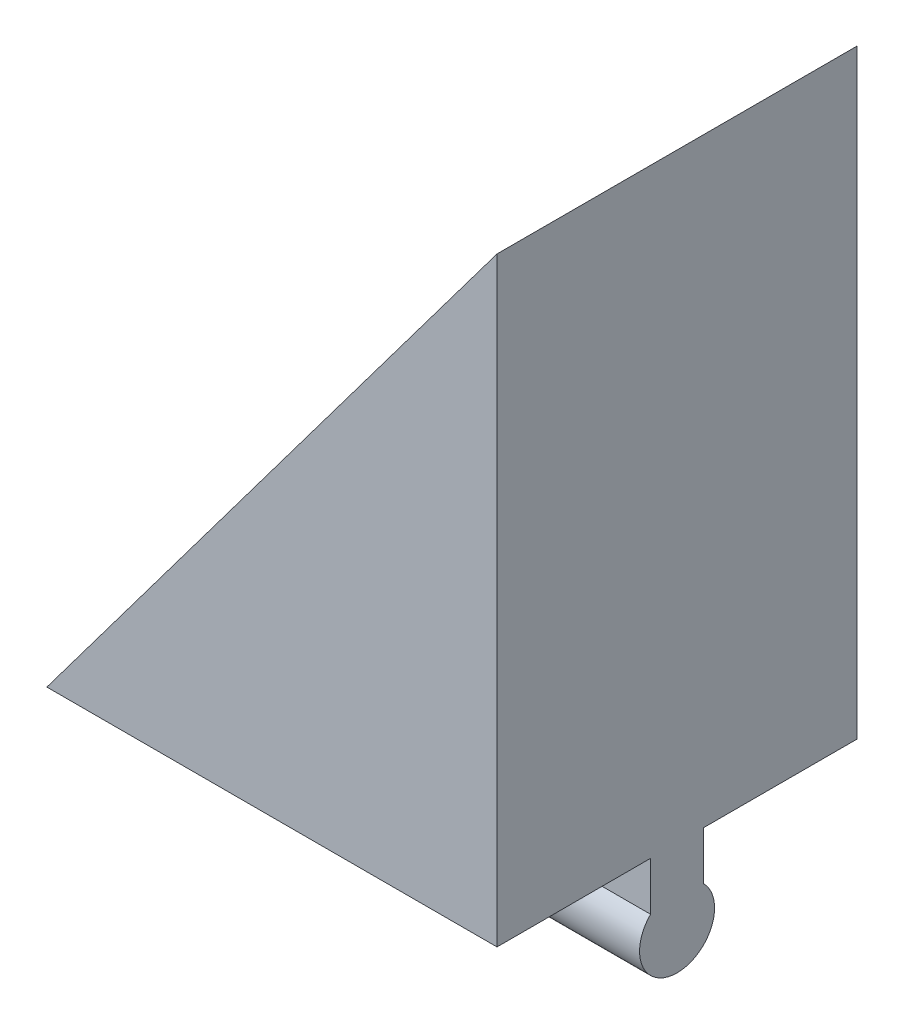
ISO-10303-21;
HEADER;
FILE_DESCRIPTION(('STEP AP214'),'2;1');
FILE_NAME('part.step','',(''),(''),'','','');
FILE_SCHEMA(('AUTOMOTIVE_DESIGN { 1 0 10303 214 1 1 1 1 }'));
ENDSEC;
DATA;
#1=APPLICATION_CONTEXT('core data for automotive mechanical design processes');
#2=APPLICATION_PROTOCOL_DEFINITION('international standard','automotive_design',2000,#1);
#3=PRODUCT_CONTEXT('',#1,'mechanical');
#4=PRODUCT('Part','Part','',(#3));
#5=PRODUCT_RELATED_PRODUCT_CATEGORY('part','',(#4));
#6=PRODUCT_DEFINITION_FORMATION('','',#4);
#7=PRODUCT_DEFINITION_CONTEXT('part definition',#1,'design');
#8=PRODUCT_DEFINITION('design','',#6,#7);
#9=PRODUCT_DEFINITION_SHAPE('','',#8);
#10=(LENGTH_UNIT() NAMED_UNIT(*) SI_UNIT(.MILLI.,.METRE.));
#11=(NAMED_UNIT(*) PLANE_ANGLE_UNIT() SI_UNIT($,.RADIAN.));
#12=(NAMED_UNIT(*) SI_UNIT($,.STERADIAN.) SOLID_ANGLE_UNIT());
#13=UNCERTAINTY_MEASURE_WITH_UNIT(LENGTH_MEASURE(1.E-05),#10,'distance_accuracy_value','');
#14=(GEOMETRIC_REPRESENTATION_CONTEXT(3) GLOBAL_UNCERTAINTY_ASSIGNED_CONTEXT((#13)) GLOBAL_UNIT_ASSIGNED_CONTEXT((#10,
#11,#12)) REPRESENTATION_CONTEXT('',''));
#15=CARTESIAN_POINT('',(0.,0.,0.));
#16=DIRECTION('',(0.,0.,1.));
#17=DIRECTION('',(1.,0.,0.));
#18=AXIS2_PLACEMENT_3D('',#15,#16,#17);
#19=CARTESIAN_POINT('',(15.,-17.,4.));
#20=DIRECTION('',(0.,-1.,0.));
#21=DIRECTION('',(0.,0.,-1.));
#22=AXIS2_PLACEMENT_3D('',#19,#20,#21);
#23=PLANE('',#22);
#24=DIRECTION('',(0.,0.,-1.));
#25=VECTOR('',#24,1.);
#26=CARTESIAN_POINT('',(-15.,-17.,24.));
#27=LINE('',#26,#25);
#28=CARTESIAN_POINT('',(-15.,-17.,24.));
#29=VERTEX_POINT('',#28);
#30=CARTESIAN_POINT('',(-15.,-17.,13.7677669529664));
#31=VERTEX_POINT('',#30);
#32=EDGE_CURVE('E48',#29,#31,#27,.T.);
#33=ORIENTED_EDGE('',*,*,#32,.T.);
#34=DIRECTION('',(1.,0.,0.));
#35=VECTOR('',#34,1.);
#36=CARTESIAN_POINT('',(-15.,-17.,13.7677669529664));
#37=LINE('',#36,#35);
#38=CARTESIAN_POINT('',(15.,-17.,13.7677669529664));
#39=VERTEX_POINT('',#38);
#40=EDGE_CURVE('E118',#31,#39,#37,.T.);
#41=ORIENTED_EDGE('',*,*,#40,.T.);
#42=DIRECTION('',(0.,0.,1.));
#43=VECTOR('',#42,1.);
#44=CARTESIAN_POINT('',(15.,-17.,4.));
#45=LINE('',#44,#43);
#46=CARTESIAN_POINT('',(15.,-17.,24.));
#47=VERTEX_POINT('',#46);
#48=EDGE_CURVE('E136',#39,#47,#45,.T.);
#49=ORIENTED_EDGE('',*,*,#48,.T.);
#50=DIRECTION('',(1.,0.,0.));
#51=VECTOR('',#50,1.);
#52=CARTESIAN_POINT('',(-15.,-17.,24.));
#53=LINE('',#52,#51);
#54=EDGE_CURVE('E129',#29,#47,#53,.T.);
#55=ORIENTED_EDGE('',*,*,#54,.F.);
#56=EDGE_LOOP('',(#33,#41,#49,#55));
#57=FACE_BOUND('',#56,.T.);
#58=ADVANCED_FACE('F40',(#57),#23,.T.);
#59=DIRECTION('',(1.,0.,0.));
#60=VECTOR('',#59,1.);
#61=CARTESIAN_POINT('',(-15.,-17.,10.2322330470336));
#62=LINE('',#61,#60);
#63=CARTESIAN_POINT('',(-15.,-17.,10.2322330470336));
#64=VERTEX_POINT('',#63);
#65=CARTESIAN_POINT('',(15.,-17.,10.2322330470336));
#66=VERTEX_POINT('',#65);
#67=EDGE_CURVE('E130',#64,#66,#62,.T.);
#68=ORIENTED_EDGE('',*,*,#67,.F.);
#69=CARTESIAN_POINT('',(-15.,-17.,0.));
#70=VERTEX_POINT('',#69);
#71=EDGE_CURVE('E149',#64,#70,#27,.T.);
#72=ORIENTED_EDGE('',*,*,#71,.T.);
#73=DIRECTION('',(1.,0.,0.));
#74=VECTOR('',#73,1.);
#75=CARTESIAN_POINT('',(-15.,-17.,0.));
#76=LINE('',#75,#74);
#77=CARTESIAN_POINT('',(15.,-17.,0.));
#78=VERTEX_POINT('',#77);
#79=EDGE_CURVE('E133',#70,#78,#76,.T.);
#80=ORIENTED_EDGE('',*,*,#79,.T.);
#81=EDGE_CURVE('E139',#78,#66,#45,.T.);
#82=ORIENTED_EDGE('',*,*,#81,.T.);
#83=EDGE_LOOP('',(#68,#72,#80,#82));
#84=FACE_BOUND('',#83,.T.);
#85=ADVANCED_FACE('F160',(#84),#23,.T.);
#86=CARTESIAN_POINT('',(15.,0.,24.));
#87=DIRECTION('',(1.,0.,0.));
#88=DIRECTION('',(0.,0.,-1.));
#89=AXIS2_PLACEMENT_3D('',#86,#87,#88);
#90=PLANE('',#89);
#91=DIRECTION('',(0.,-1.,0.));
#92=VECTOR('',#91,1.);
#93=CARTESIAN_POINT('',(15.,0.,24.));
#94=LINE('',#93,#92);
#95=CARTESIAN_POINT('',(15.,23.,24.));
#96=VERTEX_POINT('',#95);
#97=EDGE_CURVE('E143',#96,#47,#94,.T.);
#98=ORIENTED_EDGE('',*,*,#97,.T.);
#99=ORIENTED_EDGE('',*,*,#48,.F.);
#100=DIRECTION('',(0.,-1.,0.));
#101=VECTOR('',#100,1.);
#102=CARTESIAN_POINT('',(15.,0.,13.7677669529664));
#103=LINE('',#102,#101);
#104=CARTESIAN_POINT('',(15.,-20.23,13.7677669529664));
#105=VERTEX_POINT('',#104);
#106=EDGE_CURVE('E55',#39,#105,#103,.T.);
#107=ORIENTED_EDGE('',*,*,#106,.T.);
#108=CARTESIAN_POINT('',(15.,-21.9977669529664,12.));
#109=DIRECTION('',(1.,0.,0.));
#110=DIRECTION('',(0.,0.,-1.));
#111=AXIS2_PLACEMENT_3D('',#108,#109,#110);
#112=CIRCLE('',#111,2.5);
#113=CARTESIAN_POINT('',(15.,-20.23,10.2322330470336));
#114=VERTEX_POINT('',#113);
#115=EDGE_CURVE('E103',#105,#114,#112,.T.);
#116=ORIENTED_EDGE('',*,*,#115,.T.);
#117=DIRECTION('',(0.,-1.,0.));
#118=VECTOR('',#117,1.);
#119=CARTESIAN_POINT('',(15.,0.,10.2322330470336));
#120=LINE('',#119,#118);
#121=EDGE_CURVE('E119',#66,#114,#120,.T.);
#122=ORIENTED_EDGE('',*,*,#121,.F.);
#123=ORIENTED_EDGE('',*,*,#81,.F.);
#124=DIRECTION('',(0.,-1.,0.));
#125=VECTOR('',#124,1.);
#126=CARTESIAN_POINT('',(15.,0.,0.));
#127=LINE('',#126,#125);
#128=CARTESIAN_POINT('',(15.,23.,0.));
#129=VERTEX_POINT('',#128);
#130=EDGE_CURVE('E142',#129,#78,#127,.T.);
#131=ORIENTED_EDGE('',*,*,#130,.F.);
#132=DIRECTION('',(0.,0.,-1.));
#133=VECTOR('',#132,1.);
#134=CARTESIAN_POINT('',(15.,23.,24.));
#135=LINE('',#134,#133);
#136=EDGE_CURVE('E11',#96,#129,#135,.T.);
#137=ORIENTED_EDGE('',*,*,#136,.F.);
#138=EDGE_LOOP('',(#98,#99,#107,#116,#122,#123,#131,#137));
#139=FACE_BOUND('',#138,.T.);
#140=ADVANCED_FACE('F42',(#139),#90,.T.);
#141=CARTESIAN_POINT('',(-1.44,1.08,24.));
#142=DIRECTION('',(0.8,-0.6,0.));
#143=DIRECTION('',(0.6,0.8,0.));
#144=AXIS2_PLACEMENT_3D('',#141,#142,#143);
#145=PLANE('',#144);
#146=DIRECTION('',(-0.6,-0.8,0.));
#147=VECTOR('',#146,1.);
#148=CARTESIAN_POINT('',(-1.44,1.08,0.));
#149=LINE('',#148,#147);
#150=EDGE_CURVE('E146',#129,#70,#149,.T.);
#151=ORIENTED_EDGE('',*,*,#150,.T.);
#152=ORIENTED_EDGE('',*,*,#71,.F.);
#153=DIRECTION('',(0.,0.,-1.));
#154=VECTOR('',#153,1.);
#155=CARTESIAN_POINT('',(-15.,-17.,0.));
#156=LINE('',#155,#154);
#157=EDGE_CURVE('E106',#31,#64,#156,.T.);
#158=ORIENTED_EDGE('',*,*,#157,.F.);
#159=ORIENTED_EDGE('',*,*,#32,.F.);
#160=DIRECTION('',(-0.6,-0.8,0.));
#161=VECTOR('',#160,1.);
#162=CARTESIAN_POINT('',(-1.44,1.08,24.));
#163=LINE('',#162,#161);
#164=EDGE_CURVE('E145',#96,#29,#163,.T.);
#165=ORIENTED_EDGE('',*,*,#164,.F.);
#166=ORIENTED_EDGE('',*,*,#136,.T.);
#167=EDGE_LOOP('',(#151,#152,#158,#159,#165,#166));
#168=FACE_BOUND('',#167,.T.);
#169=ADVANCED_FACE('F165',(#168),#145,.F.);
#170=CARTESIAN_POINT('',(0.,0.,24.));
#171=DIRECTION('',(0.,0.,1.));
#172=DIRECTION('',(1.,0.,0.));
#173=AXIS2_PLACEMENT_3D('',#170,#171,#172);
#174=PLANE('',#173);
#175=ORIENTED_EDGE('',*,*,#54,.T.);
#176=ORIENTED_EDGE('',*,*,#97,.F.);
#177=ORIENTED_EDGE('',*,*,#164,.T.);
#178=EDGE_LOOP('',(#175,#176,#177));
#179=FACE_BOUND('',#178,.T.);
#180=ADVANCED_FACE('F168',(#179),#174,.T.);
#181=CARTESIAN_POINT('',(0.,0.,0.));
#182=DIRECTION('',(0.,0.,1.));
#183=DIRECTION('',(1.,0.,0.));
#184=AXIS2_PLACEMENT_3D('',#181,#182,#183);
#185=PLANE('',#184);
#186=ORIENTED_EDGE('',*,*,#130,.T.);
#187=ORIENTED_EDGE('',*,*,#79,.F.);
#188=ORIENTED_EDGE('',*,*,#150,.F.);
#189=EDGE_LOOP('',(#186,#187,#188));
#190=FACE_BOUND('',#189,.T.);
#191=ADVANCED_FACE('F164',(#190),#185,.F.);
#192=CARTESIAN_POINT('',(-15.,0.,13.7677669529664));
#193=DIRECTION('',(0.,0.,1.));
#194=DIRECTION('',(1.,0.,0.));
#195=AXIS2_PLACEMENT_3D('',#192,#193,#194);
#196=PLANE('',#195);
#197=ORIENTED_EDGE('',*,*,#106,.F.);
#198=ORIENTED_EDGE('',*,*,#40,.F.);
#199=DIRECTION('',(0.,-1.,0.));
#200=VECTOR('',#199,1.);
#201=CARTESIAN_POINT('',(-15.,0.,13.7677669529664));
#202=LINE('',#201,#200);
#203=CARTESIAN_POINT('',(-15.,-20.23,13.7677669529664));
#204=VERTEX_POINT('',#203);
#205=EDGE_CURVE('E111',#31,#204,#202,.T.);
#206=ORIENTED_EDGE('',*,*,#205,.T.);
#207=DIRECTION('',(1.,0.,0.));
#208=VECTOR('',#207,1.);
#209=CARTESIAN_POINT('',(-15.,-20.23,13.7677669529664));
#210=LINE('',#209,#208);
#211=EDGE_CURVE('E98',#204,#105,#210,.T.);
#212=ORIENTED_EDGE('',*,*,#211,.T.);
#213=EDGE_LOOP('',(#197,#198,#206,#212));
#214=FACE_BOUND('',#213,.T.);
#215=ADVANCED_FACE('F117',(#214),#196,.T.);
#216=CARTESIAN_POINT('',(-15.,0.,10.2322330470336));
#217=DIRECTION('',(0.,0.,1.));
#218=DIRECTION('',(1.,0.,0.));
#219=AXIS2_PLACEMENT_3D('',#216,#217,#218);
#220=PLANE('',#219);
#221=ORIENTED_EDGE('',*,*,#121,.T.);
#222=DIRECTION('',(1.,0.,0.));
#223=VECTOR('',#222,1.);
#224=CARTESIAN_POINT('',(-15.,-20.23,10.2322330470336));
#225=LINE('',#224,#223);
#226=CARTESIAN_POINT('',(-15.,-20.23,10.2322330470336));
#227=VERTEX_POINT('',#226);
#228=EDGE_CURVE('E105',#227,#114,#225,.T.);
#229=ORIENTED_EDGE('',*,*,#228,.F.);
#230=DIRECTION('',(0.,-1.,0.));
#231=VECTOR('',#230,1.);
#232=CARTESIAN_POINT('',(-15.,0.,10.2322330470336));
#233=LINE('',#232,#231);
#234=EDGE_CURVE('E114',#64,#227,#233,.T.);
#235=ORIENTED_EDGE('',*,*,#234,.F.);
#236=ORIENTED_EDGE('',*,*,#67,.T.);
#237=EDGE_LOOP('',(#221,#229,#235,#236));
#238=FACE_BOUND('',#237,.T.);
#239=ADVANCED_FACE('F270',(#238),#220,.F.);
#240=CARTESIAN_POINT('',(-15.,-21.9977669529664,12.));
#241=DIRECTION('',(1.,0.,0.));
#242=DIRECTION('',(0.,0.,-1.));
#243=AXIS2_PLACEMENT_3D('',#240,#241,#242);
#244=CYLINDRICAL_SURFACE('',#243,2.5);
#245=ORIENTED_EDGE('',*,*,#115,.F.);
#246=ORIENTED_EDGE('',*,*,#211,.F.);
#247=CARTESIAN_POINT('',(-15.,-21.9977669529664,12.));
#248=DIRECTION('',(1.,0.,0.));
#249=DIRECTION('',(0.,0.,-1.));
#250=AXIS2_PLACEMENT_3D('',#247,#248,#249);
#251=CIRCLE('',#250,2.5);
#252=EDGE_CURVE('E101',#204,#227,#251,.T.);
#253=ORIENTED_EDGE('',*,*,#252,.T.);
#254=ORIENTED_EDGE('',*,*,#228,.T.);
#255=EDGE_LOOP('',(#245,#246,#253,#254));
#256=FACE_BOUND('',#255,.T.);
#257=ADVANCED_FACE('F100',(#256),#244,.T.);
#258=CARTESIAN_POINT('',(-15.,0.,0.));
#259=DIRECTION('',(1.,0.,0.));
#260=DIRECTION('',(0.,0.,-1.));
#261=AXIS2_PLACEMENT_3D('',#258,#259,#260);
#262=PLANE('',#261);
#263=ORIENTED_EDGE('',*,*,#205,.F.);
#264=ORIENTED_EDGE('',*,*,#157,.T.);
#265=ORIENTED_EDGE('',*,*,#234,.T.);
#266=ORIENTED_EDGE('',*,*,#252,.F.);
#267=EDGE_LOOP('',(#263,#264,#265,#266));
#268=FACE_BOUND('',#267,.T.);
#269=ADVANCED_FACE('F110',(#268),#262,.F.);
#270=CLOSED_SHELL('',(#58,#85,#140,#169,#180,#191,#215,#239,#257,#269));
#271=MANIFOLD_SOLID_BREP('B2',#270);
#272=ADVANCED_BREP_SHAPE_REPRESENTATION('',(#18,#271),#14);
#273=SHAPE_DEFINITION_REPRESENTATION(#9,#272);
ENDSEC;
END-ISO-10303-21;
